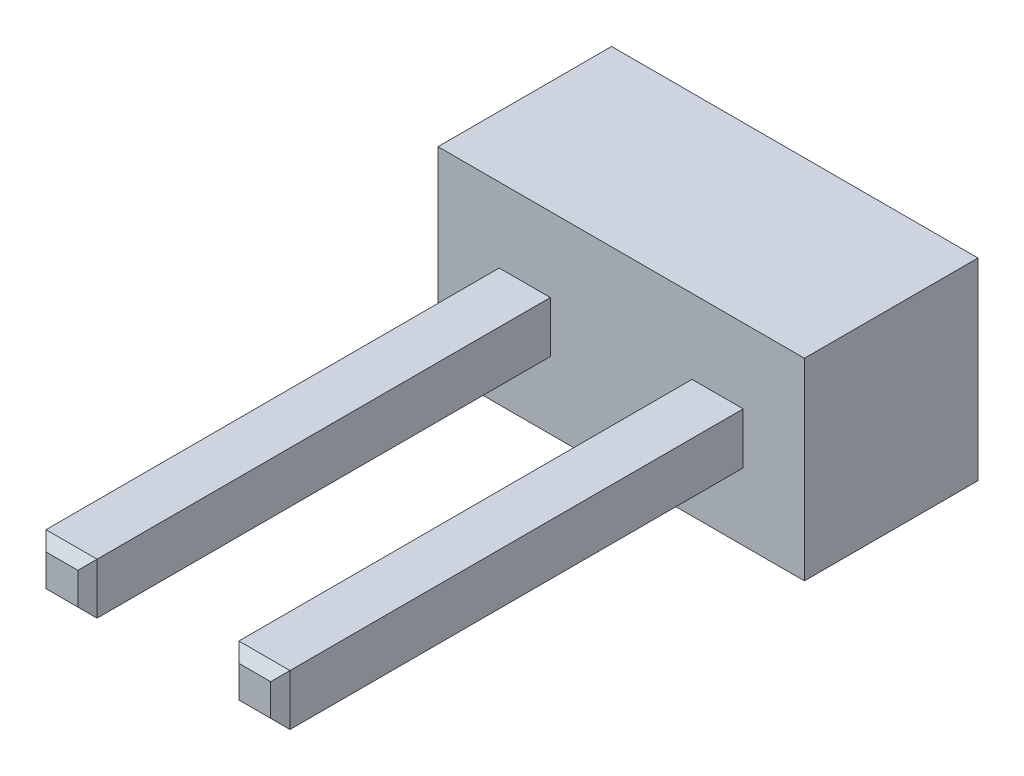
ISO-10303-21;
HEADER;
FILE_DESCRIPTION(('STEP AP214'),'2;1');
FILE_NAME('part.step','',(''),(''),'','','');
FILE_SCHEMA(('AUTOMOTIVE_DESIGN { 1 0 10303 214 1 1 1 1 }'));
ENDSEC;
DATA;
#1=APPLICATION_CONTEXT('core data for automotive mechanical design processes');
#2=APPLICATION_PROTOCOL_DEFINITION('international standard','automotive_design',2000,#1);
#3=PRODUCT_CONTEXT('',#1,'mechanical');
#4=PRODUCT('Part','Part','',(#3));
#5=PRODUCT_RELATED_PRODUCT_CATEGORY('part','',(#4));
#6=PRODUCT_DEFINITION_FORMATION('','',#4);
#7=PRODUCT_DEFINITION_CONTEXT('part definition',#1,'design');
#8=PRODUCT_DEFINITION('design','',#6,#7);
#9=PRODUCT_DEFINITION_SHAPE('','',#8);
#10=(LENGTH_UNIT() NAMED_UNIT(*) SI_UNIT(.MILLI.,.METRE.));
#11=(NAMED_UNIT(*) PLANE_ANGLE_UNIT() SI_UNIT($,.RADIAN.));
#12=(NAMED_UNIT(*) SI_UNIT($,.STERADIAN.) SOLID_ANGLE_UNIT());
#13=UNCERTAINTY_MEASURE_WITH_UNIT(LENGTH_MEASURE(1.E-05),#10,'distance_accuracy_value','');
#14=(GEOMETRIC_REPRESENTATION_CONTEXT(3) GLOBAL_UNCERTAINTY_ASSIGNED_CONTEXT((#13)) GLOBAL_UNIT_ASSIGNED_CONTEXT((#10,
#11,#12)) REPRESENTATION_CONTEXT('',''));
#15=CARTESIAN_POINT('',(0.,0.,0.));
#16=DIRECTION('',(0.,0.,1.));
#17=DIRECTION('',(1.,0.,0.));
#18=AXIS2_PLACEMENT_3D('',#15,#16,#17);
#19=CARTESIAN_POINT('',(-2.74955,1.55928543201802,7.239));
#20=DIRECTION('',(-0.707106781186598,0.,0.707106781186498));
#21=DIRECTION('',(0.707106781186498,0.,0.707106781186598));
#22=AXIS2_PLACEMENT_3D('',#19,#20,#21);
#23=PLANE('',#22);
#24=DIRECTION('',(0.,1.,0.));
#25=VECTOR('',#24,1.);
#26=CARTESIAN_POINT('',(-2.87655,1.55928543201802,7.11199999999999));
#27=LINE('',#26,#25);
#28=CARTESIAN_POINT('',(-2.87654999999999,1.55928543201802,7.11199999999999));
#29=VERTEX_POINT('',#28);
#30=CARTESIAN_POINT('',(-2.87655,0.886185432018028,7.11199999999999));
#31=VERTEX_POINT('',#30);
#32=EDGE_CURVE('E151',#29,#31,#27,.F.);
#33=ORIENTED_EDGE('',*,*,#32,.T.);
#34=DIRECTION('',(-0.577350269189624,-0.577350269189586,-0.577350269189667));
#35=VECTOR('',#34,1.);
#36=CARTESIAN_POINT('',(-2.74955,1.01318543201802,7.239));
#37=LINE('',#36,#35);
#38=CARTESIAN_POINT('',(-2.74955,1.01318543201802,7.239));
#39=VERTEX_POINT('',#38);
#40=EDGE_CURVE('E142',#39,#31,#37,.T.);
#41=ORIENTED_EDGE('',*,*,#40,.F.);
#42=DIRECTION('',(0.,1.,0.));
#43=VECTOR('',#42,1.);
#44=CARTESIAN_POINT('',(-2.74955,1.55928543201802,7.239));
#45=LINE('',#44,#43);
#46=CARTESIAN_POINT('',(-2.74955,1.43228543201802,7.239));
#47=VERTEX_POINT('',#46);
#48=EDGE_CURVE('E19',#47,#39,#45,.F.);
#49=ORIENTED_EDGE('',*,*,#48,.F.);
#50=DIRECTION('',(0.577350269189608,-0.577350269189594,0.577350269189675));
#51=VECTOR('',#50,1.);
#52=CARTESIAN_POINT('',(-2.87655,1.55928543201801,7.11199999999999));
#53=LINE('',#52,#51);
#54=EDGE_CURVE('E132',#29,#47,#53,.T.);
#55=ORIENTED_EDGE('',*,*,#54,.F.);
#56=EDGE_LOOP('',(#33,#41,#49,#55));
#57=FACE_BOUND('',#56,.T.);
#58=ADVANCED_FACE('F16',(#57),#23,.T.);
#59=CARTESIAN_POINT('',(-0.20955,0.886185432018022,7.239));
#60=DIRECTION('',(-0.707106781186598,0.,0.707106781186498));
#61=DIRECTION('',(0.707106781186498,0.,0.707106781186598));
#62=AXIS2_PLACEMENT_3D('',#59,#60,#61);
#63=PLANE('',#62);
#64=DIRECTION('',(0.,1.,0.));
#65=VECTOR('',#64,1.);
#66=CARTESIAN_POINT('',(-0.20955,0.886185432018022,7.239));
#67=LINE('',#66,#65);
#68=CARTESIAN_POINT('',(-0.20955,1.43228543201802,7.239));
#69=VERTEX_POINT('',#68);
#70=CARTESIAN_POINT('',(-0.20955,1.01318543201802,7.239));
#71=VERTEX_POINT('',#70);
#72=EDGE_CURVE('E155',#69,#71,#67,.F.);
#73=ORIENTED_EDGE('',*,*,#72,.F.);
#74=DIRECTION('',(0.577350269189608,-0.577350269189594,0.577350269189675));
#75=VECTOR('',#74,1.);
#76=CARTESIAN_POINT('',(-0.336549999999995,1.55928543201801,7.11199999999999));
#77=LINE('',#76,#75);
#78=CARTESIAN_POINT('',(-0.336549999999993,1.55928543201802,7.11199999999999));
#79=VERTEX_POINT('',#78);
#80=EDGE_CURVE('E159',#79,#69,#77,.T.);
#81=ORIENTED_EDGE('',*,*,#80,.F.);
#82=DIRECTION('',(0.,1.,0.));
#83=VECTOR('',#82,1.);
#84=CARTESIAN_POINT('',(-0.33655,1.55928543201802,7.11199999999999));
#85=LINE('',#84,#83);
#86=CARTESIAN_POINT('',(-0.336549999999995,0.886185432018028,7.11199999999999));
#87=VERTEX_POINT('',#86);
#88=EDGE_CURVE('E167',#79,#87,#85,.F.);
#89=ORIENTED_EDGE('',*,*,#88,.T.);
#90=DIRECTION('',(-0.577350269189624,-0.577350269189586,-0.577350269189667));
#91=VECTOR('',#90,1.);
#92=CARTESIAN_POINT('',(-0.20955,1.01318543201802,7.239));
#93=LINE('',#92,#91);
#94=EDGE_CURVE('E165',#71,#87,#93,.T.);
#95=ORIENTED_EDGE('',*,*,#94,.F.);
#96=EDGE_LOOP('',(#73,#81,#89,#95));
#97=FACE_BOUND('',#96,.T.);
#98=ADVANCED_FACE('F357',(#97),#63,.T.);
#99=CARTESIAN_POINT('',(-2.87655,1.55928543201802,7.239));
#100=DIRECTION('',(0.,0.,1.));
#101=DIRECTION('',(1.,0.,0.));
#102=AXIS2_PLACEMENT_3D('',#99,#100,#101);
#103=PLANE('',#102);
#104=DIRECTION('',(1.,0.,0.));
#105=VECTOR('',#104,1.);
#106=CARTESIAN_POINT('',(-2.87655,1.01318543201802,7.239));
#107=LINE('',#106,#105);
#108=CARTESIAN_POINT('',(-2.33045,1.01318543201802,7.239));
#109=VERTEX_POINT('',#108);
#110=EDGE_CURVE('E146',#109,#39,#107,.F.);
#111=ORIENTED_EDGE('',*,*,#110,.F.);
#112=DIRECTION('',(0.,1.,0.));
#113=VECTOR('',#112,1.);
#114=CARTESIAN_POINT('',(-2.33045,1.55928543201802,7.239));
#115=LINE('',#114,#113);
#116=CARTESIAN_POINT('',(-2.33045,1.43228543201802,7.239));
#117=VERTEX_POINT('',#116);
#118=EDGE_CURVE('E145',#117,#109,#115,.F.);
#119=ORIENTED_EDGE('',*,*,#118,.F.);
#120=DIRECTION('',(1.,0.,0.));
#121=VECTOR('',#120,1.);
#122=CARTESIAN_POINT('',(-2.87655,1.43228543201802,7.239));
#123=LINE('',#122,#121);
#124=EDGE_CURVE('E135',#47,#117,#123,.T.);
#125=ORIENTED_EDGE('',*,*,#124,.F.);
#126=ORIENTED_EDGE('',*,*,#48,.T.);
#127=EDGE_LOOP('',(#111,#119,#125,#126));
#128=FACE_BOUND('',#127,.T.);
#129=ADVANCED_FACE('F144',(#128),#103,.T.);
#130=CARTESIAN_POINT('',(-2.87655,1.43228543201802,7.239));
#131=DIRECTION('',(0.,0.707106781186598,0.707106781186498));
#132=DIRECTION('',(0.,-0.707106781186498,0.707106781186598));
#133=AXIS2_PLACEMENT_3D('',#130,#131,#132);
#134=PLANE('',#133);
#135=ORIENTED_EDGE('',*,*,#124,.T.);
#136=DIRECTION('',(-0.577350269189586,-0.577350269189623,0.577350269189669));
#137=VECTOR('',#136,1.);
#138=CARTESIAN_POINT('',(-2.20345000000001,1.55928543201802,7.11199999999999));
#139=LINE('',#138,#137);
#140=CARTESIAN_POINT('',(-2.20345,1.55928543201802,7.11199999999999));
#141=VERTEX_POINT('',#140);
#142=EDGE_CURVE('E172',#141,#117,#139,.T.);
#143=ORIENTED_EDGE('',*,*,#142,.F.);
#144=DIRECTION('',(1.,0.,0.));
#145=VECTOR('',#144,1.);
#146=CARTESIAN_POINT('',(-2.87655,1.55928543201802,7.11199999999999));
#147=LINE('',#146,#145);
#148=EDGE_CURVE('E137',#141,#29,#147,.F.);
#149=ORIENTED_EDGE('',*,*,#148,.T.);
#150=ORIENTED_EDGE('',*,*,#54,.T.);
#151=EDGE_LOOP('',(#135,#143,#149,#150));
#152=FACE_BOUND('',#151,.T.);
#153=ADVANCED_FACE('F133',(#152),#134,.T.);
#154=CARTESIAN_POINT('',(-2.87655,1.01318543201802,7.239));
#155=DIRECTION('',(0.,-0.707106781186598,0.707106781186498));
#156=DIRECTION('',(0.,-0.707106781186498,-0.707106781186598));
#157=AXIS2_PLACEMENT_3D('',#154,#155,#156);
#158=PLANE('',#157);
#159=ORIENTED_EDGE('',*,*,#110,.T.);
#160=ORIENTED_EDGE('',*,*,#40,.T.);
#161=DIRECTION('',(1.,0.,0.));
#162=VECTOR('',#161,1.);
#163=CARTESIAN_POINT('',(-2.87655,0.886185432018022,7.11199999999999));
#164=LINE('',#163,#162);
#165=CARTESIAN_POINT('',(-2.20345,0.886185432018028,7.11199999999999));
#166=VERTEX_POINT('',#165);
#167=EDGE_CURVE('E183',#31,#166,#164,.T.);
#168=ORIENTED_EDGE('',*,*,#167,.T.);
#169=DIRECTION('',(0.577350269189594,-0.577350269189607,-0.577350269189677));
#170=VECTOR('',#169,1.);
#171=CARTESIAN_POINT('',(-2.33045,1.01318543201802,7.239));
#172=LINE('',#171,#170);
#173=EDGE_CURVE('E175',#109,#166,#172,.T.);
#174=ORIENTED_EDGE('',*,*,#173,.F.);
#175=EDGE_LOOP('',(#159,#160,#168,#174));
#176=FACE_BOUND('',#175,.T.);
#177=ADVANCED_FACE('F349',(#176),#158,.T.);
#178=CARTESIAN_POINT('',(-2.87655,1.55928543201802,7.239));
#179=DIRECTION('',(1.,0.,0.));
#180=DIRECTION('',(0.,0.,-1.));
#181=AXIS2_PLACEMENT_3D('',#178,#179,#180);
#182=PLANE('',#181);
#183=DIRECTION('',(0.,1.,0.));
#184=VECTOR('',#183,1.);
#185=CARTESIAN_POINT('',(-2.87655,1.55928543201802,1.143));
#186=LINE('',#185,#184);
#187=CARTESIAN_POINT('',(-2.87655,0.886185432018023,1.143));
#188=VERTEX_POINT('',#187);
#189=CARTESIAN_POINT('',(-2.87655,1.55928543201802,1.143));
#190=VERTEX_POINT('',#189);
#191=EDGE_CURVE('E153',#188,#190,#186,.T.);
#192=ORIENTED_EDGE('',*,*,#191,.F.);
#193=DIRECTION('',(0.,0.,1.));
#194=VECTOR('',#193,1.);
#195=CARTESIAN_POINT('',(-2.87655,0.886185432018022,7.239));
#196=LINE('',#195,#194);
#197=EDGE_CURVE('E189',#188,#31,#196,.T.);
#198=ORIENTED_EDGE('',*,*,#197,.T.);
#199=ORIENTED_EDGE('',*,*,#32,.F.);
#200=DIRECTION('',(0.,0.,-1.));
#201=VECTOR('',#200,1.);
#202=CARTESIAN_POINT('',(-2.87655,1.55928543201802,7.239));
#203=LINE('',#202,#201);
#204=EDGE_CURVE('E178',#29,#190,#203,.T.);
#205=ORIENTED_EDGE('',*,*,#204,.T.);
#206=EDGE_LOOP('',(#192,#198,#199,#205));
#207=FACE_BOUND('',#206,.T.);
#208=ADVANCED_FACE('F345',(#207),#182,.F.);
#209=CARTESIAN_POINT('',(-0.33655,0.886185432018022,7.239));
#210=DIRECTION('',(0.,0.,1.));
#211=DIRECTION('',(1.,0.,0.));
#212=AXIS2_PLACEMENT_3D('',#209,#210,#211);
#213=PLANE('',#212);
#214=ORIENTED_EDGE('',*,*,#72,.T.);
#215=DIRECTION('',(1.,0.,0.));
#216=VECTOR('',#215,1.);
#217=CARTESIAN_POINT('',(-0.33655,1.01318543201802,7.239));
#218=LINE('',#217,#216);
#219=CARTESIAN_POINT('',(0.20955,1.01318543201802,7.239));
#220=VERTEX_POINT('',#219);
#221=EDGE_CURVE('E162',#220,#71,#218,.F.);
#222=ORIENTED_EDGE('',*,*,#221,.F.);
#223=DIRECTION('',(0.,1.,0.));
#224=VECTOR('',#223,1.);
#225=CARTESIAN_POINT('',(0.20955,0.886185432018022,7.239));
#226=LINE('',#225,#224);
#227=CARTESIAN_POINT('',(0.20955,1.43228543201802,7.239));
#228=VERTEX_POINT('',#227);
#229=EDGE_CURVE('E195',#228,#220,#226,.F.);
#230=ORIENTED_EDGE('',*,*,#229,.F.);
#231=DIRECTION('',(1.,0.,0.));
#232=VECTOR('',#231,1.);
#233=CARTESIAN_POINT('',(-0.33655,1.43228543201802,7.239));
#234=LINE('',#233,#232);
#235=EDGE_CURVE('E157',#69,#228,#234,.T.);
#236=ORIENTED_EDGE('',*,*,#235,.F.);
#237=EDGE_LOOP('',(#214,#222,#230,#236));
#238=FACE_BOUND('',#237,.T.);
#239=ADVANCED_FACE('F341',(#238),#213,.T.);
#240=CARTESIAN_POINT('',(-0.33655,1.43228543201802,7.239));
#241=DIRECTION('',(0.,0.707106781186598,0.707106781186498));
#242=DIRECTION('',(0.,-0.707106781186498,0.707106781186598));
#243=AXIS2_PLACEMENT_3D('',#240,#241,#242);
#244=PLANE('',#243);
#245=DIRECTION('',(1.,0.,0.));
#246=VECTOR('',#245,1.);
#247=CARTESIAN_POINT('',(-0.33655,1.55928543201802,7.11199999999999));
#248=LINE('',#247,#246);
#249=CARTESIAN_POINT('',(0.336549999999996,1.55928543201802,7.11199999999999));
#250=VERTEX_POINT('',#249);
#251=EDGE_CURVE('E199',#250,#79,#248,.F.);
#252=ORIENTED_EDGE('',*,*,#251,.T.);
#253=ORIENTED_EDGE('',*,*,#80,.T.);
#254=ORIENTED_EDGE('',*,*,#235,.T.);
#255=DIRECTION('',(-0.577350269189586,-0.577350269189625,0.577350269189667));
#256=VECTOR('',#255,1.);
#257=CARTESIAN_POINT('',(0.33654999999999,1.55928543201802,7.11199999999999));
#258=LINE('',#257,#256);
#259=EDGE_CURVE('E192',#250,#228,#258,.T.);
#260=ORIENTED_EDGE('',*,*,#259,.F.);
#261=EDGE_LOOP('',(#252,#253,#254,#260));
#262=FACE_BOUND('',#261,.T.);
#263=ADVANCED_FACE('F337',(#262),#244,.T.);
#264=CARTESIAN_POINT('',(-0.33655,1.01318543201802,7.239));
#265=DIRECTION('',(0.,-0.707106781186598,0.707106781186498));
#266=DIRECTION('',(0.,-0.707106781186498,-0.707106781186598));
#267=AXIS2_PLACEMENT_3D('',#264,#265,#266);
#268=PLANE('',#267);
#269=ORIENTED_EDGE('',*,*,#221,.T.);
#270=ORIENTED_EDGE('',*,*,#94,.T.);
#271=DIRECTION('',(1.,0.,0.));
#272=VECTOR('',#271,1.);
#273=CARTESIAN_POINT('',(-0.33655,0.886185432018022,7.11199999999999));
#274=LINE('',#273,#272);
#275=CARTESIAN_POINT('',(0.336549999999997,0.886185432018028,7.11199999999999));
#276=VERTEX_POINT('',#275);
#277=EDGE_CURVE('E207',#87,#276,#274,.T.);
#278=ORIENTED_EDGE('',*,*,#277,.T.);
#279=DIRECTION('',(0.577350269189594,-0.577350269189608,-0.577350269189675));
#280=VECTOR('',#279,1.);
#281=CARTESIAN_POINT('',(0.20955,1.01318543201802,7.239));
#282=LINE('',#281,#280);
#283=EDGE_CURVE('E197',#220,#276,#282,.T.);
#284=ORIENTED_EDGE('',*,*,#283,.F.);
#285=EDGE_LOOP('',(#269,#270,#278,#284));
#286=FACE_BOUND('',#285,.T.);
#287=ADVANCED_FACE('F333',(#286),#268,.T.);
#288=CARTESIAN_POINT('',(-0.33655,1.55928543201802,7.239));
#289=DIRECTION('',(1.,0.,0.));
#290=DIRECTION('',(0.,0.,-1.));
#291=AXIS2_PLACEMENT_3D('',#288,#289,#290);
#292=PLANE('',#291);
#293=DIRECTION('',(0.,1.,0.));
#294=VECTOR('',#293,1.);
#295=CARTESIAN_POINT('',(-0.33655,1.55928543201802,1.143));
#296=LINE('',#295,#294);
#297=CARTESIAN_POINT('',(-0.33655,0.886185432018023,1.143));
#298=VERTEX_POINT('',#297);
#299=CARTESIAN_POINT('',(-0.336549999999999,1.55928543201802,1.143));
#300=VERTEX_POINT('',#299);
#301=EDGE_CURVE('E170',#298,#300,#296,.T.);
#302=ORIENTED_EDGE('',*,*,#301,.F.);
#303=DIRECTION('',(0.,0.,1.));
#304=VECTOR('',#303,1.);
#305=CARTESIAN_POINT('',(-0.33655,0.886185432018022,7.239));
#306=LINE('',#305,#304);
#307=EDGE_CURVE('E213',#298,#87,#306,.T.);
#308=ORIENTED_EDGE('',*,*,#307,.T.);
#309=ORIENTED_EDGE('',*,*,#88,.F.);
#310=DIRECTION('',(0.,0.,-1.));
#311=VECTOR('',#310,1.);
#312=CARTESIAN_POINT('',(-0.336549999999995,1.55928543201802,7.239));
#313=LINE('',#312,#311);
#314=EDGE_CURVE('E202',#79,#300,#313,.T.);
#315=ORIENTED_EDGE('',*,*,#314,.T.);
#316=EDGE_LOOP('',(#302,#308,#309,#315));
#317=FACE_BOUND('',#316,.T.);
#318=ADVANCED_FACE('F329',(#317),#292,.F.);
#319=CARTESIAN_POINT('',(-2.33045,1.55928543201802,7.239));
#320=DIRECTION('',(0.707106781186598,0.,0.707106781186498));
#321=DIRECTION('',(0.707106781186498,0.,-0.707106781186598));
#322=AXIS2_PLACEMENT_3D('',#319,#320,#321);
#323=PLANE('',#322);
#324=ORIENTED_EDGE('',*,*,#118,.T.);
#325=ORIENTED_EDGE('',*,*,#173,.T.);
#326=DIRECTION('',(0.,1.,0.));
#327=VECTOR('',#326,1.);
#328=CARTESIAN_POINT('',(-2.20345,1.55928543201802,7.11199999999999));
#329=LINE('',#328,#327);
#330=EDGE_CURVE('E216',#166,#141,#329,.T.);
#331=ORIENTED_EDGE('',*,*,#330,.T.);
#332=ORIENTED_EDGE('',*,*,#142,.T.);
#333=EDGE_LOOP('',(#324,#325,#331,#332));
#334=FACE_BOUND('',#333,.T.);
#335=ADVANCED_FACE('F325',(#334),#323,.T.);
#336=CARTESIAN_POINT('',(-2.87655,1.55928543201802,7.239));
#337=DIRECTION('',(0.,-1.,0.));
#338=DIRECTION('',(0.,0.,-1.));
#339=AXIS2_PLACEMENT_3D('',#336,#337,#338);
#340=PLANE('',#339);
#341=DIRECTION('',(1.,0.,0.));
#342=VECTOR('',#341,1.);
#343=CARTESIAN_POINT('',(-2.87655,1.55928543201802,1.143));
#344=LINE('',#343,#342);
#345=CARTESIAN_POINT('',(-2.20345,1.55928543201802,1.143));
#346=VERTEX_POINT('',#345);
#347=EDGE_CURVE('E181',#190,#346,#344,.T.);
#348=ORIENTED_EDGE('',*,*,#347,.F.);
#349=ORIENTED_EDGE('',*,*,#204,.F.);
#350=ORIENTED_EDGE('',*,*,#148,.F.);
#351=DIRECTION('',(0.,0.,1.));
#352=VECTOR('',#351,1.);
#353=CARTESIAN_POINT('',(-2.20345,1.55928543201802,7.239));
#354=LINE('',#353,#352);
#355=EDGE_CURVE('E219',#141,#346,#354,.F.);
#356=ORIENTED_EDGE('',*,*,#355,.T.);
#357=EDGE_LOOP('',(#348,#349,#350,#356));
#358=FACE_BOUND('',#357,.T.);
#359=ADVANCED_FACE('F321',(#358),#340,.F.);
#360=CARTESIAN_POINT('',(-2.87655,0.886185432018022,7.239));
#361=DIRECTION('',(0.,1.,0.));
#362=DIRECTION('',(0.,0.,1.));
#363=AXIS2_PLACEMENT_3D('',#360,#361,#362);
#364=PLANE('',#363);
#365=DIRECTION('',(1.,0.,0.));
#366=VECTOR('',#365,1.);
#367=CARTESIAN_POINT('',(-2.87655,0.886185432018022,1.143));
#368=LINE('',#367,#366);
#369=CARTESIAN_POINT('',(-2.20345,0.886185432018022,1.143));
#370=VERTEX_POINT('',#369);
#371=EDGE_CURVE('E186',#370,#188,#368,.F.);
#372=ORIENTED_EDGE('',*,*,#371,.F.);
#373=DIRECTION('',(0.,0.,1.));
#374=VECTOR('',#373,1.);
#375=CARTESIAN_POINT('',(-2.20345,0.886185432018022,7.239));
#376=LINE('',#375,#374);
#377=EDGE_CURVE('E222',#370,#166,#376,.T.);
#378=ORIENTED_EDGE('',*,*,#377,.T.);
#379=ORIENTED_EDGE('',*,*,#167,.F.);
#380=ORIENTED_EDGE('',*,*,#197,.F.);
#381=EDGE_LOOP('',(#372,#378,#379,#380));
#382=FACE_BOUND('',#381,.T.);
#383=ADVANCED_FACE('F317',(#382),#364,.F.);
#384=CARTESIAN_POINT('',(0.20955,0.886185432018022,7.239));
#385=DIRECTION('',(0.707106781186598,0.,0.707106781186498));
#386=DIRECTION('',(0.707106781186498,0.,-0.707106781186598));
#387=AXIS2_PLACEMENT_3D('',#384,#385,#386);
#388=PLANE('',#387);
#389=ORIENTED_EDGE('',*,*,#229,.T.);
#390=ORIENTED_EDGE('',*,*,#283,.T.);
#391=DIRECTION('',(0.,1.,0.));
#392=VECTOR('',#391,1.);
#393=CARTESIAN_POINT('',(0.33655,1.55928543201802,7.11199999999999));
#394=LINE('',#393,#392);
#395=EDGE_CURVE('E225',#276,#250,#394,.T.);
#396=ORIENTED_EDGE('',*,*,#395,.T.);
#397=ORIENTED_EDGE('',*,*,#259,.T.);
#398=EDGE_LOOP('',(#389,#390,#396,#397));
#399=FACE_BOUND('',#398,.T.);
#400=ADVANCED_FACE('F313',(#399),#388,.T.);
#401=CARTESIAN_POINT('',(-0.33655,1.55928543201802,7.239));
#402=DIRECTION('',(0.,-1.,0.));
#403=DIRECTION('',(0.,0.,-1.));
#404=AXIS2_PLACEMENT_3D('',#401,#402,#403);
#405=PLANE('',#404);
#406=DIRECTION('',(1.,0.,0.));
#407=VECTOR('',#406,1.);
#408=CARTESIAN_POINT('',(-0.33655,1.55928543201802,1.143));
#409=LINE('',#408,#407);
#410=CARTESIAN_POINT('',(0.33655,1.55928543201802,1.143));
#411=VERTEX_POINT('',#410);
#412=EDGE_CURVE('E205',#300,#411,#409,.T.);
#413=ORIENTED_EDGE('',*,*,#412,.F.);
#414=ORIENTED_EDGE('',*,*,#314,.F.);
#415=ORIENTED_EDGE('',*,*,#251,.F.);
#416=DIRECTION('',(0.,0.,1.));
#417=VECTOR('',#416,1.);
#418=CARTESIAN_POINT('',(0.33655,1.55928543201802,7.239));
#419=LINE('',#418,#417);
#420=EDGE_CURVE('E228',#250,#411,#419,.F.);
#421=ORIENTED_EDGE('',*,*,#420,.T.);
#422=EDGE_LOOP('',(#413,#414,#415,#421));
#423=FACE_BOUND('',#422,.T.);
#424=ADVANCED_FACE('F309',(#423),#405,.F.);
#425=CARTESIAN_POINT('',(-0.33655,0.886185432018022,7.239));
#426=DIRECTION('',(0.,1.,0.));
#427=DIRECTION('',(0.,0.,1.));
#428=AXIS2_PLACEMENT_3D('',#425,#426,#427);
#429=PLANE('',#428);
#430=DIRECTION('',(1.,0.,0.));
#431=VECTOR('',#430,1.);
#432=CARTESIAN_POINT('',(-0.33655,0.886185432018022,1.143));
#433=LINE('',#432,#431);
#434=CARTESIAN_POINT('',(0.336549999999999,0.886185432018022,1.143));
#435=VERTEX_POINT('',#434);
#436=EDGE_CURVE('E210',#435,#298,#433,.F.);
#437=ORIENTED_EDGE('',*,*,#436,.F.);
#438=DIRECTION('',(0.,0.,1.));
#439=VECTOR('',#438,1.);
#440=CARTESIAN_POINT('',(0.33655,0.886185432018022,7.239));
#441=LINE('',#440,#439);
#442=EDGE_CURVE('E231',#435,#276,#441,.T.);
#443=ORIENTED_EDGE('',*,*,#442,.T.);
#444=ORIENTED_EDGE('',*,*,#277,.F.);
#445=ORIENTED_EDGE('',*,*,#307,.F.);
#446=EDGE_LOOP('',(#437,#443,#444,#445));
#447=FACE_BOUND('',#446,.T.);
#448=ADVANCED_FACE('F305',(#447),#429,.F.);
#449=CARTESIAN_POINT('',(-2.20345,1.55928543201802,7.239));
#450=DIRECTION('',(-1.,0.,0.));
#451=DIRECTION('',(0.,0.,1.));
#452=AXIS2_PLACEMENT_3D('',#449,#450,#451);
#453=PLANE('',#452);
#454=DIRECTION('',(0.,1.,0.));
#455=VECTOR('',#454,1.);
#456=CARTESIAN_POINT('',(-2.20345,2.54,1.143));
#457=LINE('',#456,#455);
#458=EDGE_CURVE('E234',#370,#346,#457,.T.);
#459=ORIENTED_EDGE('',*,*,#458,.T.);
#460=ORIENTED_EDGE('',*,*,#355,.F.);
#461=ORIENTED_EDGE('',*,*,#330,.F.);
#462=ORIENTED_EDGE('',*,*,#377,.F.);
#463=EDGE_LOOP('',(#459,#460,#461,#462));
#464=FACE_BOUND('',#463,.T.);
#465=ADVANCED_FACE('F301',(#464),#453,.F.);
#466=CARTESIAN_POINT('',(0.33655,1.55928543201802,7.239));
#467=DIRECTION('',(-1.,0.,0.));
#468=DIRECTION('',(0.,0.,1.));
#469=AXIS2_PLACEMENT_3D('',#466,#467,#468);
#470=PLANE('',#469);
#471=DIRECTION('',(0.,1.,0.));
#472=VECTOR('',#471,1.);
#473=CARTESIAN_POINT('',(0.33655,2.54,1.143));
#474=LINE('',#473,#472);
#475=EDGE_CURVE('E237',#435,#411,#474,.T.);
#476=ORIENTED_EDGE('',*,*,#475,.T.);
#477=ORIENTED_EDGE('',*,*,#420,.F.);
#478=ORIENTED_EDGE('',*,*,#395,.F.);
#479=ORIENTED_EDGE('',*,*,#442,.F.);
#480=EDGE_LOOP('',(#476,#477,#478,#479));
#481=FACE_BOUND('',#480,.T.);
#482=ADVANCED_FACE('F297',(#481),#470,.F.);
#483=CARTESIAN_POINT('',(-3.683,2.54,1.143));
#484=DIRECTION('',(0.,0.,-1.));
#485=DIRECTION('',(-1.,0.,0.));
#486=AXIS2_PLACEMENT_3D('',#483,#484,#485);
#487=PLANE('',#486);
#488=DIRECTION('',(0.,1.,0.));
#489=VECTOR('',#488,1.);
#490=CARTESIAN_POINT('',(-3.683,2.54,1.143));
#491=LINE('',#490,#489);
#492=CARTESIAN_POINT('',(-3.683,2.54,1.143));
#493=VERTEX_POINT('',#492);
#494=CARTESIAN_POINT('',(-3.683,0.,1.143));
#495=VERTEX_POINT('',#494);
#496=EDGE_CURVE('E247',#493,#495,#491,.F.);
#497=ORIENTED_EDGE('',*,*,#496,.T.);
#498=DIRECTION('',(1.,0.,0.));
#499=VECTOR('',#498,1.);
#500=CARTESIAN_POINT('',(-3.683,0.,1.143));
#501=LINE('',#500,#499);
#502=CARTESIAN_POINT('',(1.143,0.,1.143));
#503=VERTEX_POINT('',#502);
#504=EDGE_CURVE('E256',#495,#503,#501,.T.);
#505=ORIENTED_EDGE('',*,*,#504,.T.);
#506=DIRECTION('',(0.,1.,0.));
#507=VECTOR('',#506,1.);
#508=CARTESIAN_POINT('',(1.143,2.78260682186184,1.143));
#509=LINE('',#508,#507);
#510=CARTESIAN_POINT('',(1.143,2.54,1.143));
#511=VERTEX_POINT('',#510);
#512=EDGE_CURVE('E240',#503,#511,#509,.T.);
#513=ORIENTED_EDGE('',*,*,#512,.T.);
#514=DIRECTION('',(1.,0.,0.));
#515=VECTOR('',#514,1.);
#516=CARTESIAN_POINT('',(-3.683,2.54,1.143));
#517=LINE('',#516,#515);
#518=EDGE_CURVE('E243',#493,#511,#517,.T.);
#519=ORIENTED_EDGE('',*,*,#518,.F.);
#520=EDGE_LOOP('',(#497,#505,#513,#519));
#521=FACE_BOUND('',#520,.T.);
#522=ORIENTED_EDGE('',*,*,#436,.T.);
#523=ORIENTED_EDGE('',*,*,#301,.T.);
#524=ORIENTED_EDGE('',*,*,#412,.T.);
#525=ORIENTED_EDGE('',*,*,#475,.F.);
#526=EDGE_LOOP('',(#522,#523,#524,#525));
#527=FACE_BOUND('',#526,.T.);
#528=ORIENTED_EDGE('',*,*,#371,.T.);
#529=ORIENTED_EDGE('',*,*,#191,.T.);
#530=ORIENTED_EDGE('',*,*,#347,.T.);
#531=ORIENTED_EDGE('',*,*,#458,.F.);
#532=EDGE_LOOP('',(#528,#529,#530,#531));
#533=FACE_BOUND('',#532,.T.);
#534=ADVANCED_FACE('F294',(#521,#527,#533),#487,.F.);
#535=CARTESIAN_POINT('',(1.143,2.78260682186184,-1.397));
#536=DIRECTION('',(-1.,0.,0.));
#537=DIRECTION('',(0.,0.,1.));
#538=AXIS2_PLACEMENT_3D('',#535,#536,#537);
#539=PLANE('',#538);
#540=DIRECTION('',(0.,1.,0.));
#541=VECTOR('',#540,1.);
#542=CARTESIAN_POINT('',(1.143,2.54,-1.143));
#543=LINE('',#542,#541);
#544=CARTESIAN_POINT('',(1.143,0.,-1.143));
#545=VERTEX_POINT('',#544);
#546=CARTESIAN_POINT('',(1.143,2.54,-1.143));
#547=VERTEX_POINT('',#546);
#548=EDGE_CURVE('E259',#545,#547,#543,.T.);
#549=ORIENTED_EDGE('',*,*,#548,.T.);
#550=DIRECTION('',(0.,0.,1.));
#551=VECTOR('',#550,1.);
#552=CARTESIAN_POINT('',(1.143,2.54,1.143));
#553=LINE('',#552,#551);
#554=EDGE_CURVE('E245',#511,#547,#553,.F.);
#555=ORIENTED_EDGE('',*,*,#554,.F.);
#556=ORIENTED_EDGE('',*,*,#512,.F.);
#557=DIRECTION('',(0.,0.,1.));
#558=VECTOR('',#557,1.);
#559=CARTESIAN_POINT('',(1.143,0.,1.143));
#560=LINE('',#559,#558);
#561=EDGE_CURVE('E252',#503,#545,#560,.F.);
#562=ORIENTED_EDGE('',*,*,#561,.T.);
#563=EDGE_LOOP('',(#549,#555,#556,#562));
#564=FACE_BOUND('',#563,.T.);
#565=ADVANCED_FACE('F277',(#564),#539,.F.);
#566=CARTESIAN_POINT('',(-3.683,2.54,1.143));
#567=DIRECTION('',(0.,1.,0.));
#568=DIRECTION('',(0.,0.,1.));
#569=AXIS2_PLACEMENT_3D('',#566,#567,#568);
#570=PLANE('',#569);
#571=ORIENTED_EDGE('',*,*,#518,.T.);
#572=ORIENTED_EDGE('',*,*,#554,.T.);
#573=DIRECTION('',(1.,0.,0.));
#574=VECTOR('',#573,1.);
#575=CARTESIAN_POINT('',(-3.683,2.54,-1.143));
#576=LINE('',#575,#574);
#577=CARTESIAN_POINT('',(-3.683,2.54,-1.143));
#578=VERTEX_POINT('',#577);
#579=EDGE_CURVE('E262',#547,#578,#576,.F.);
#580=ORIENTED_EDGE('',*,*,#579,.T.);
#581=DIRECTION('',(0.,0.,-1.));
#582=VECTOR('',#581,1.);
#583=CARTESIAN_POINT('',(-3.683,2.54,-1.143));
#584=LINE('',#583,#582);
#585=EDGE_CURVE('E249',#578,#493,#584,.F.);
#586=ORIENTED_EDGE('',*,*,#585,.T.);
#587=EDGE_LOOP('',(#571,#572,#580,#586));
#588=FACE_BOUND('',#587,.T.);
#589=ADVANCED_FACE('F273',(#588),#570,.T.);
#590=CARTESIAN_POINT('',(-3.683,2.54,-1.143));
#591=DIRECTION('',(1.,0.,0.));
#592=DIRECTION('',(0.,0.,-1.));
#593=AXIS2_PLACEMENT_3D('',#590,#591,#592);
#594=PLANE('',#593);
#595=DIRECTION('',(0.,1.,0.));
#596=VECTOR('',#595,1.);
#597=CARTESIAN_POINT('',(-3.683,2.54,-1.143));
#598=LINE('',#597,#596);
#599=CARTESIAN_POINT('',(-3.683,0.,-1.143));
#600=VERTEX_POINT('',#599);
#601=EDGE_CURVE('E25',#578,#600,#598,.F.);
#602=ORIENTED_EDGE('',*,*,#601,.T.);
#603=DIRECTION('',(0.,0.,1.));
#604=VECTOR('',#603,1.);
#605=CARTESIAN_POINT('',(-3.683,0.,1.143));
#606=LINE('',#605,#604);
#607=EDGE_CURVE('E33',#600,#495,#606,.T.);
#608=ORIENTED_EDGE('',*,*,#607,.T.);
#609=ORIENTED_EDGE('',*,*,#496,.F.);
#610=ORIENTED_EDGE('',*,*,#585,.F.);
#611=EDGE_LOOP('',(#602,#608,#609,#610));
#612=FACE_BOUND('',#611,.T.);
#613=ADVANCED_FACE('F268',(#612),#594,.F.);
#614=CARTESIAN_POINT('',(-3.683,0.,1.143));
#615=DIRECTION('',(0.,1.,0.));
#616=DIRECTION('',(0.,0.,1.));
#617=AXIS2_PLACEMENT_3D('',#614,#615,#616);
#618=PLANE('',#617);
#619=ORIENTED_EDGE('',*,*,#607,.F.);
#620=DIRECTION('',(1.,0.,0.));
#621=VECTOR('',#620,1.);
#622=CARTESIAN_POINT('',(-3.683,0.,-1.143));
#623=LINE('',#622,#621);
#624=EDGE_CURVE('E11',#600,#545,#623,.T.);
#625=ORIENTED_EDGE('',*,*,#624,.T.);
#626=ORIENTED_EDGE('',*,*,#561,.F.);
#627=ORIENTED_EDGE('',*,*,#504,.F.);
#628=EDGE_LOOP('',(#619,#625,#626,#627));
#629=FACE_BOUND('',#628,.T.);
#630=ADVANCED_FACE('F279',(#629),#618,.F.);
#631=CARTESIAN_POINT('',(-3.683,2.54,-1.143));
#632=DIRECTION('',(0.,0.,1.));
#633=DIRECTION('',(1.,0.,0.));
#634=AXIS2_PLACEMENT_3D('',#631,#632,#633);
#635=PLANE('',#634);
#636=ORIENTED_EDGE('',*,*,#601,.F.);
#637=ORIENTED_EDGE('',*,*,#579,.F.);
#638=ORIENTED_EDGE('',*,*,#548,.F.);
#639=ORIENTED_EDGE('',*,*,#624,.F.);
#640=EDGE_LOOP('',(#636,#637,#638,#639));
#641=FACE_BOUND('',#640,.T.);
#642=ADVANCED_FACE('F271',(#641),#635,.F.);
#643=CLOSED_SHELL('',(#58,#98,#129,#153,#177,#208,#239,#263,#287,#318,#335,#359,#383,#400,#424,
#448,#465,#482,#534,#565,#589,#613,#630,#642));
#644=MANIFOLD_SOLID_BREP('B1',#643);
#645=ADVANCED_BREP_SHAPE_REPRESENTATION('',(#18,#644),#14);
#646=SHAPE_DEFINITION_REPRESENTATION(#9,#645);
ENDSEC;
END-ISO-10303-21;
